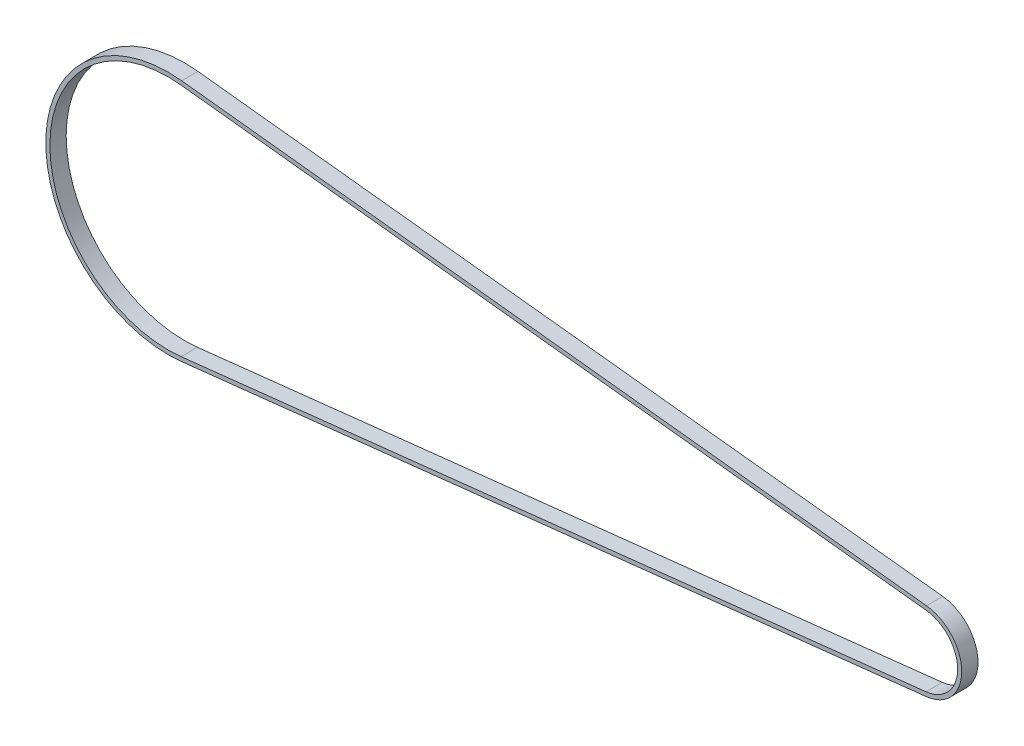
ISO-10303-21;
HEADER;
FILE_DESCRIPTION(('STEP AP214'),'2;1');
FILE_NAME('part.step','',(''),(''),'','','');
FILE_SCHEMA(('AUTOMOTIVE_DESIGN { 1 0 10303 214 1 1 1 1 }'));
ENDSEC;
DATA;
#1=APPLICATION_CONTEXT('core data for automotive mechanical design processes');
#2=APPLICATION_PROTOCOL_DEFINITION('international standard','automotive_design',2000,#1);
#3=PRODUCT_CONTEXT('',#1,'mechanical');
#4=PRODUCT('Part','Part','',(#3));
#5=PRODUCT_RELATED_PRODUCT_CATEGORY('part','',(#4));
#6=PRODUCT_DEFINITION_FORMATION('','',#4);
#7=PRODUCT_DEFINITION_CONTEXT('part definition',#1,'design');
#8=PRODUCT_DEFINITION('design','',#6,#7);
#9=PRODUCT_DEFINITION_SHAPE('','',#8);
#10=(LENGTH_UNIT() NAMED_UNIT(*) SI_UNIT(.MILLI.,.METRE.));
#11=(NAMED_UNIT(*) PLANE_ANGLE_UNIT() SI_UNIT($,.RADIAN.));
#12=(NAMED_UNIT(*) SI_UNIT($,.STERADIAN.) SOLID_ANGLE_UNIT());
#13=UNCERTAINTY_MEASURE_WITH_UNIT(LENGTH_MEASURE(1.E-05),#10,'distance_accuracy_value','');
#14=(GEOMETRIC_REPRESENTATION_CONTEXT(3) GLOBAL_UNCERTAINTY_ASSIGNED_CONTEXT((#13)) GLOBAL_UNIT_ASSIGNED_CONTEXT((#10,
#11,#12)) REPRESENTATION_CONTEXT('',''));
#15=CARTESIAN_POINT('',(0.,0.,0.));
#16=DIRECTION('',(0.,0.,1.));
#17=DIRECTION('',(1.,0.,0.));
#18=AXIS2_PLACEMENT_3D('',#15,#16,#17);
#19=CARTESIAN_POINT('',(882.3706,0.,19.05));
#20=DIRECTION('',(0.,0.,1.));
#21=DIRECTION('',(1.,0.,0.));
#22=AXIS2_PLACEMENT_3D('',#19,#20,#21);
#23=PLANE('',#22);
#24=CARTESIAN_POINT('',(882.3706,0.,19.05));
#25=DIRECTION('',(0.,0.,1.));
#26=DIRECTION('',(1.,0.,0.));
#27=AXIS2_PLACEMENT_3D('',#24,#25,#26);
#28=CIRCLE('',#27,46.3677);
#29=CARTESIAN_POINT('',(887.458647220703,-46.0876922699532,19.05));
#30=VERTEX_POINT('',#29);
#31=CARTESIAN_POINT('',(887.458647220703,46.0876922699531,19.05));
#32=VERTEX_POINT('',#31);
#33=EDGE_CURVE('E158',#30,#32,#28,.T.);
#34=ORIENTED_EDGE('',*,*,#33,.T.);
#35=DIRECTION('',(-0.993961146874939,0.109732577218688,0.));
#36=VECTOR('',#35,1.);
#37=CARTESIAN_POINT('',(15.712882063387,142.32778152389,19.05));
#38=LINE('',#37,#36);
#39=CARTESIAN_POINT('',(15.712882063387,142.32778152389,19.05));
#40=VERTEX_POINT('',#39);
#41=EDGE_CURVE('E161',#32,#40,#38,.T.);
#42=ORIENTED_EDGE('',*,*,#41,.T.);
#43=CARTESIAN_POINT('',(0.,0.,19.05));
#44=DIRECTION('',(0.,0.,1.));
#45=DIRECTION('',(1.,0.,0.));
#46=AXIS2_PLACEMENT_3D('',#43,#44,#45);
#47=CIRCLE('',#46,143.1925);
#48=CARTESIAN_POINT('',(15.712882063387,-142.32778152389,19.05));
#49=VERTEX_POINT('',#48);
#50=EDGE_CURVE('E164',#40,#49,#47,.T.);
#51=ORIENTED_EDGE('',*,*,#50,.T.);
#52=DIRECTION('',(0.993961146874939,0.109732577218688,0.));
#53=VECTOR('',#52,1.);
#54=CARTESIAN_POINT('',(887.458647220703,-46.0876922699532,19.05));
#55=LINE('',#54,#53);
#56=EDGE_CURVE('E166',#49,#30,#55,.T.);
#57=ORIENTED_EDGE('',*,*,#56,.T.);
#58=EDGE_LOOP('',(#34,#42,#51,#57));
#59=FACE_BOUND('',#58,.T.);
#60=DIRECTION('',(-0.993961146874939,0.109732577218688,0.));
#61=VECTOR('',#60,1.);
#62=CARTESIAN_POINT('',(15.190280664383,137.594041561898,19.05));
#63=LINE('',#62,#61);
#64=CARTESIAN_POINT('',(886.936045821699,41.3539523079613,19.05));
#65=VERTEX_POINT('',#64);
#66=CARTESIAN_POINT('',(15.190280664383,137.594041561898,19.05));
#67=VERTEX_POINT('',#66);
#68=EDGE_CURVE('E130',#65,#67,#63,.T.);
#69=ORIENTED_EDGE('',*,*,#68,.F.);
#70=CARTESIAN_POINT('',(882.3706,0.,19.05));
#71=DIRECTION('',(0.,0.,1.));
#72=DIRECTION('',(1.,0.,0.));
#73=AXIS2_PLACEMENT_3D('',#70,#71,#72);
#74=CIRCLE('',#73,41.6052);
#75=CARTESIAN_POINT('',(886.936045821699,-41.3539523079613,19.05));
#76=VERTEX_POINT('',#75);
#77=EDGE_CURVE('E122',#76,#65,#74,.T.);
#78=ORIENTED_EDGE('',*,*,#77,.F.);
#79=DIRECTION('',(0.993961146874939,0.109732577218688,0.));
#80=VECTOR('',#79,1.);
#81=CARTESIAN_POINT('',(886.936045821699,-41.3539523079613,19.05));
#82=LINE('',#81,#80);
#83=CARTESIAN_POINT('',(15.190280664383,-137.594041561898,19.05));
#84=VERTEX_POINT('',#83);
#85=EDGE_CURVE('E144',#84,#76,#82,.T.);
#86=ORIENTED_EDGE('',*,*,#85,.F.);
#87=CARTESIAN_POINT('',(0.,0.,19.05));
#88=DIRECTION('',(0.,0.,1.));
#89=DIRECTION('',(1.,0.,0.));
#90=AXIS2_PLACEMENT_3D('',#87,#88,#89);
#91=CIRCLE('',#90,138.43);
#92=EDGE_CURVE('E142',#67,#84,#91,.T.);
#93=ORIENTED_EDGE('',*,*,#92,.F.);
#94=EDGE_LOOP('',(#69,#78,#86,#93));
#95=FACE_BOUND('',#94,.T.);
#96=ADVANCED_FACE('F57',(#59,#95),#23,.T.);
#97=CARTESIAN_POINT('',(882.3706,0.,0.));
#98=DIRECTION('',(0.,0.,1.));
#99=DIRECTION('',(1.,0.,0.));
#100=AXIS2_PLACEMENT_3D('',#97,#98,#99);
#101=PLANE('',#100);
#102=CARTESIAN_POINT('',(882.3706,0.,0.));
#103=DIRECTION('',(0.,0.,1.));
#104=DIRECTION('',(1.,0.,0.));
#105=AXIS2_PLACEMENT_3D('',#102,#103,#104);
#106=CIRCLE('',#105,46.3677);
#107=CARTESIAN_POINT('',(887.458647220703,-46.0876922699532,0.));
#108=VERTEX_POINT('',#107);
#109=CARTESIAN_POINT('',(887.458647220703,46.0876922699531,0.));
#110=VERTEX_POINT('',#109);
#111=EDGE_CURVE('E138',#108,#110,#106,.T.);
#112=ORIENTED_EDGE('',*,*,#111,.F.);
#113=DIRECTION('',(0.993961146874939,0.109732577218688,0.));
#114=VECTOR('',#113,1.);
#115=CARTESIAN_POINT('',(887.458647220703,-46.0876922699532,0.));
#116=LINE('',#115,#114);
#117=CARTESIAN_POINT('',(15.712882063387,-142.32778152389,0.));
#118=VERTEX_POINT('',#117);
#119=EDGE_CURVE('E162',#118,#108,#116,.T.);
#120=ORIENTED_EDGE('',*,*,#119,.F.);
#121=CARTESIAN_POINT('',(0.,0.,0.));
#122=DIRECTION('',(0.,0.,1.));
#123=DIRECTION('',(1.,0.,0.));
#124=AXIS2_PLACEMENT_3D('',#121,#122,#123);
#125=CIRCLE('',#124,143.1925);
#126=CARTESIAN_POINT('',(15.712882063387,142.32778152389,0.));
#127=VERTEX_POINT('',#126);
#128=EDGE_CURVE('E173',#127,#118,#125,.T.);
#129=ORIENTED_EDGE('',*,*,#128,.F.);
#130=DIRECTION('',(-0.993961146874939,0.109732577218688,0.));
#131=VECTOR('',#130,1.);
#132=CARTESIAN_POINT('',(15.712882063387,142.32778152389,0.));
#133=LINE('',#132,#131);
#134=EDGE_CURVE('E171',#110,#127,#133,.T.);
#135=ORIENTED_EDGE('',*,*,#134,.F.);
#136=EDGE_LOOP('',(#112,#120,#129,#135));
#137=FACE_BOUND('',#136,.T.);
#138=CARTESIAN_POINT('',(882.3706,0.,0.));
#139=DIRECTION('',(0.,0.,1.));
#140=DIRECTION('',(1.,0.,0.));
#141=AXIS2_PLACEMENT_3D('',#138,#139,#140);
#142=CIRCLE('',#141,41.6052);
#143=CARTESIAN_POINT('',(886.936045821699,-41.3539523079613,0.));
#144=VERTEX_POINT('',#143);
#145=CARTESIAN_POINT('',(886.936045821699,41.3539523079613,0.));
#146=VERTEX_POINT('',#145);
#147=EDGE_CURVE('E80',#144,#146,#142,.T.);
#148=ORIENTED_EDGE('',*,*,#147,.T.);
#149=DIRECTION('',(-0.993961146874939,0.109732577218688,0.));
#150=VECTOR('',#149,1.);
#151=CARTESIAN_POINT('',(15.190280664383,137.594041561898,0.));
#152=LINE('',#151,#150);
#153=CARTESIAN_POINT('',(15.190280664383,137.594041561898,0.));
#154=VERTEX_POINT('',#153);
#155=EDGE_CURVE('E137',#146,#154,#152,.T.);
#156=ORIENTED_EDGE('',*,*,#155,.T.);
#157=CARTESIAN_POINT('',(0.,0.,0.));
#158=DIRECTION('',(0.,0.,1.));
#159=DIRECTION('',(1.,0.,0.));
#160=AXIS2_PLACEMENT_3D('',#157,#158,#159);
#161=CIRCLE('',#160,138.43);
#162=CARTESIAN_POINT('',(15.190280664383,-137.594041561898,0.));
#163=VERTEX_POINT('',#162);
#164=EDGE_CURVE('E150',#154,#163,#161,.T.);
#165=ORIENTED_EDGE('',*,*,#164,.T.);
#166=DIRECTION('',(0.993961146874939,0.109732577218688,0.));
#167=VECTOR('',#166,1.);
#168=CARTESIAN_POINT('',(886.936045821699,-41.3539523079613,0.));
#169=LINE('',#168,#167);
#170=EDGE_CURVE('E131',#163,#144,#169,.T.);
#171=ORIENTED_EDGE('',*,*,#170,.T.);
#172=EDGE_LOOP('',(#148,#156,#165,#171));
#173=FACE_BOUND('',#172,.T.);
#174=ADVANCED_FACE('F191',(#137,#173),#101,.F.);
#175=CARTESIAN_POINT('',(882.3706,0.,19.05));
#176=DIRECTION('',(0.,0.,-1.));
#177=DIRECTION('',(-1.,0.,0.));
#178=AXIS2_PLACEMENT_3D('',#175,#176,#177);
#179=CYLINDRICAL_SURFACE('',#178,46.3677);
#180=ORIENTED_EDGE('',*,*,#111,.T.);
#181=DIRECTION('',(0.,0.,-1.));
#182=VECTOR('',#181,1.);
#183=CARTESIAN_POINT('',(887.458647220703,46.0876922699531,19.05));
#184=LINE('',#183,#182);
#185=EDGE_CURVE('E12',#32,#110,#184,.T.);
#186=ORIENTED_EDGE('',*,*,#185,.F.);
#187=ORIENTED_EDGE('',*,*,#33,.F.);
#188=DIRECTION('',(0.,0.,-1.));
#189=VECTOR('',#188,1.);
#190=CARTESIAN_POINT('',(887.458647220703,-46.0876922699532,19.05));
#191=LINE('',#190,#189);
#192=EDGE_CURVE('E168',#30,#108,#191,.T.);
#193=ORIENTED_EDGE('',*,*,#192,.T.);
#194=EDGE_LOOP('',(#180,#186,#187,#193));
#195=FACE_BOUND('',#194,.T.);
#196=ADVANCED_FACE('F59',(#195),#179,.T.);
#197=CARTESIAN_POINT('',(15.712882063387,142.32778152389,19.05));
#198=DIRECTION('',(-0.109732577218688,-0.993961146874939,0.));
#199=DIRECTION('',(0.993961146874939,-0.109732577218688,0.));
#200=AXIS2_PLACEMENT_3D('',#197,#198,#199);
#201=PLANE('',#200);
#202=ORIENTED_EDGE('',*,*,#134,.T.);
#203=DIRECTION('',(0.,0.,-1.));
#204=VECTOR('',#203,1.);
#205=CARTESIAN_POINT('',(15.712882063387,142.32778152389,19.05));
#206=LINE('',#205,#204);
#207=EDGE_CURVE('E65',#40,#127,#206,.T.);
#208=ORIENTED_EDGE('',*,*,#207,.F.);
#209=ORIENTED_EDGE('',*,*,#41,.F.);
#210=ORIENTED_EDGE('',*,*,#185,.T.);
#211=EDGE_LOOP('',(#202,#208,#209,#210));
#212=FACE_BOUND('',#211,.T.);
#213=ADVANCED_FACE('F201',(#212),#201,.F.);
#214=CARTESIAN_POINT('',(0.,0.,19.05));
#215=DIRECTION('',(0.,0.,-1.));
#216=DIRECTION('',(-1.,0.,0.));
#217=AXIS2_PLACEMENT_3D('',#214,#215,#216);
#218=CYLINDRICAL_SURFACE('',#217,143.1925);
#219=ORIENTED_EDGE('',*,*,#128,.T.);
#220=DIRECTION('',(0.,0.,-1.));
#221=VECTOR('',#220,1.);
#222=CARTESIAN_POINT('',(15.712882063387,-142.32778152389,19.05));
#223=LINE('',#222,#221);
#224=EDGE_CURVE('E178',#49,#118,#223,.T.);
#225=ORIENTED_EDGE('',*,*,#224,.F.);
#226=ORIENTED_EDGE('',*,*,#50,.F.);
#227=ORIENTED_EDGE('',*,*,#207,.T.);
#228=EDGE_LOOP('',(#219,#225,#226,#227));
#229=FACE_BOUND('',#228,.T.);
#230=ADVANCED_FACE('F185',(#229),#218,.T.);
#231=CARTESIAN_POINT('',(887.458647220703,-46.0876922699532,19.05));
#232=DIRECTION('',(-0.109732577218688,0.993961146874939,0.));
#233=DIRECTION('',(-0.993961146874939,-0.109732577218688,0.));
#234=AXIS2_PLACEMENT_3D('',#231,#232,#233);
#235=PLANE('',#234);
#236=ORIENTED_EDGE('',*,*,#119,.T.);
#237=ORIENTED_EDGE('',*,*,#192,.F.);
#238=ORIENTED_EDGE('',*,*,#56,.F.);
#239=ORIENTED_EDGE('',*,*,#224,.T.);
#240=EDGE_LOOP('',(#236,#237,#238,#239));
#241=FACE_BOUND('',#240,.T.);
#242=ADVANCED_FACE('F195',(#241),#235,.F.);
#243=CARTESIAN_POINT('',(882.3706,0.,19.05));
#244=DIRECTION('',(0.,0.,-1.));
#245=DIRECTION('',(-1.,0.,0.));
#246=AXIS2_PLACEMENT_3D('',#243,#244,#245);
#247=CYLINDRICAL_SURFACE('',#246,41.6052);
#248=ORIENTED_EDGE('',*,*,#147,.F.);
#249=DIRECTION('',(0.,0.,-1.));
#250=VECTOR('',#249,1.);
#251=CARTESIAN_POINT('',(886.936045821699,-41.3539523079613,19.05));
#252=LINE('',#251,#250);
#253=EDGE_CURVE('E126',#76,#144,#252,.T.);
#254=ORIENTED_EDGE('',*,*,#253,.F.);
#255=ORIENTED_EDGE('',*,*,#77,.T.);
#256=DIRECTION('',(0.,0.,-1.));
#257=VECTOR('',#256,1.);
#258=CARTESIAN_POINT('',(886.936045821699,41.3539523079613,19.05));
#259=LINE('',#258,#257);
#260=EDGE_CURVE('E125',#65,#146,#259,.T.);
#261=ORIENTED_EDGE('',*,*,#260,.T.);
#262=EDGE_LOOP('',(#248,#254,#255,#261));
#263=FACE_BOUND('',#262,.T.);
#264=ADVANCED_FACE('F124',(#263),#247,.F.);
#265=CARTESIAN_POINT('',(15.190280664383,137.594041561898,19.05));
#266=DIRECTION('',(-0.109732577218688,-0.993961146874939,0.));
#267=DIRECTION('',(0.993961146874939,-0.109732577218688,0.));
#268=AXIS2_PLACEMENT_3D('',#265,#266,#267);
#269=PLANE('',#268);
#270=ORIENTED_EDGE('',*,*,#155,.F.);
#271=ORIENTED_EDGE('',*,*,#260,.F.);
#272=ORIENTED_EDGE('',*,*,#68,.T.);
#273=DIRECTION('',(0.,0.,-1.));
#274=VECTOR('',#273,1.);
#275=CARTESIAN_POINT('',(15.190280664383,137.594041561898,19.05));
#276=LINE('',#275,#274);
#277=EDGE_CURVE('E139',#67,#154,#276,.T.);
#278=ORIENTED_EDGE('',*,*,#277,.T.);
#279=EDGE_LOOP('',(#270,#271,#272,#278));
#280=FACE_BOUND('',#279,.T.);
#281=ADVANCED_FACE('F134',(#280),#269,.T.);
#282=CARTESIAN_POINT('',(0.,0.,19.05));
#283=DIRECTION('',(0.,0.,-1.));
#284=DIRECTION('',(-1.,0.,0.));
#285=AXIS2_PLACEMENT_3D('',#282,#283,#284);
#286=CYLINDRICAL_SURFACE('',#285,138.43);
#287=ORIENTED_EDGE('',*,*,#164,.F.);
#288=ORIENTED_EDGE('',*,*,#277,.F.);
#289=ORIENTED_EDGE('',*,*,#92,.T.);
#290=DIRECTION('',(0.,0.,-1.));
#291=VECTOR('',#290,1.);
#292=CARTESIAN_POINT('',(15.190280664383,-137.594041561898,19.05));
#293=LINE('',#292,#291);
#294=EDGE_CURVE('E72',#84,#163,#293,.T.);
#295=ORIENTED_EDGE('',*,*,#294,.T.);
#296=EDGE_LOOP('',(#287,#288,#289,#295));
#297=FACE_BOUND('',#296,.T.);
#298=ADVANCED_FACE('F224',(#297),#286,.F.);
#299=CARTESIAN_POINT('',(886.936045821699,-41.3539523079613,19.05));
#300=DIRECTION('',(-0.109732577218688,0.993961146874939,0.));
#301=DIRECTION('',(-0.993961146874939,-0.109732577218688,0.));
#302=AXIS2_PLACEMENT_3D('',#299,#300,#301);
#303=PLANE('',#302);
#304=ORIENTED_EDGE('',*,*,#170,.F.);
#305=ORIENTED_EDGE('',*,*,#294,.F.);
#306=ORIENTED_EDGE('',*,*,#85,.T.);
#307=ORIENTED_EDGE('',*,*,#253,.T.);
#308=EDGE_LOOP('',(#304,#305,#306,#307));
#309=FACE_BOUND('',#308,.T.);
#310=ADVANCED_FACE('F228',(#309),#303,.T.);
#311=CLOSED_SHELL('',(#96,#174,#196,#213,#230,#242,#264,#281,#298,#310));
#312=MANIFOLD_SOLID_BREP('B2',#311);
#313=ADVANCED_BREP_SHAPE_REPRESENTATION('',(#18,#312),#14);
#314=SHAPE_DEFINITION_REPRESENTATION(#9,#313);
ENDSEC;
END-ISO-10303-21;
